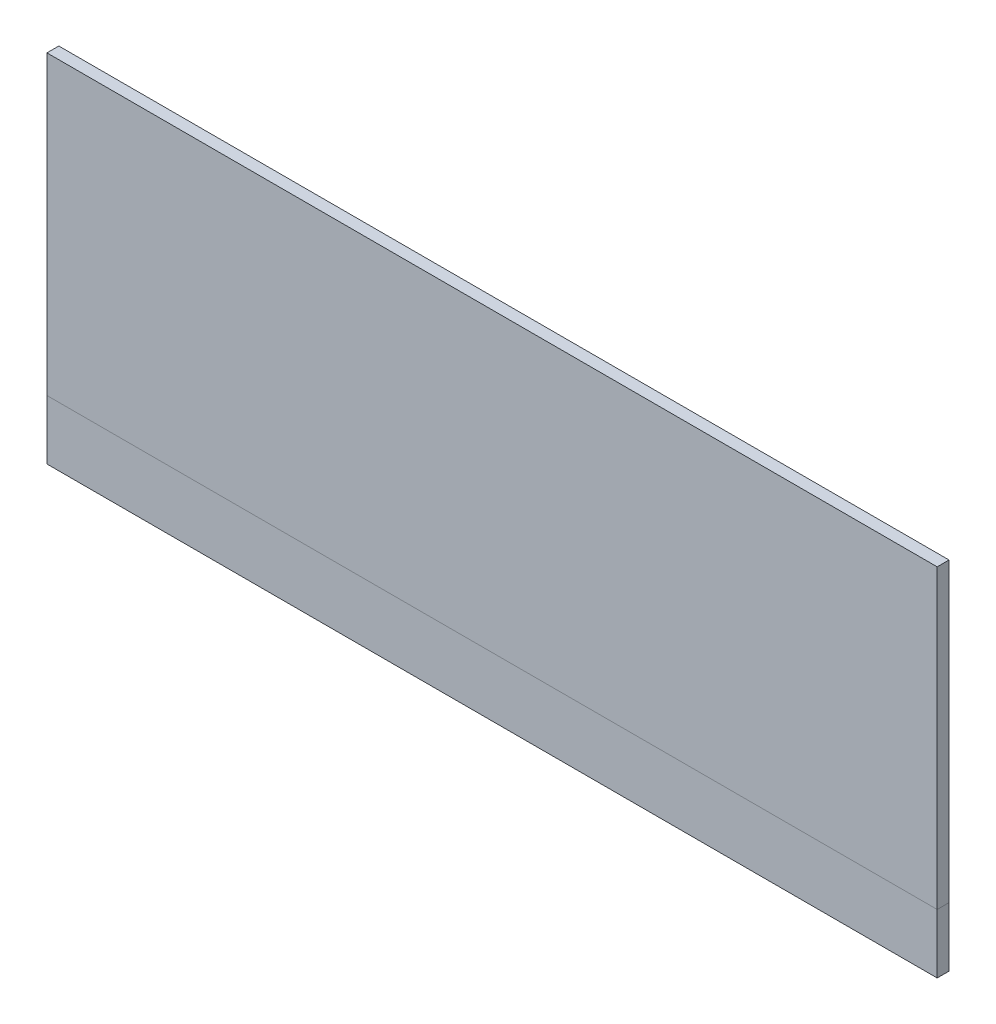
ISO-10303-21;
HEADER;
FILE_DESCRIPTION(('STEP AP214'),'2;1');
FILE_NAME('part.step','',(''),(''),'','','');
FILE_SCHEMA(('AUTOMOTIVE_DESIGN { 1 0 10303 214 1 1 1 1 }'));
ENDSEC;
DATA;
#1=APPLICATION_CONTEXT('core data for automotive mechanical design processes');
#2=APPLICATION_PROTOCOL_DEFINITION('international standard','automotive_design',2000,#1);
#3=PRODUCT_CONTEXT('',#1,'mechanical');
#4=PRODUCT('Part','Part','',(#3));
#5=PRODUCT_RELATED_PRODUCT_CATEGORY('part','',(#4));
#6=PRODUCT_DEFINITION_FORMATION('','',#4);
#7=PRODUCT_DEFINITION_CONTEXT('part definition',#1,'design');
#8=PRODUCT_DEFINITION('design','',#6,#7);
#9=PRODUCT_DEFINITION_SHAPE('','',#8);
#10=(LENGTH_UNIT() NAMED_UNIT(*) SI_UNIT(.MILLI.,.METRE.));
#11=(NAMED_UNIT(*) PLANE_ANGLE_UNIT() SI_UNIT($,.RADIAN.));
#12=(NAMED_UNIT(*) SI_UNIT($,.STERADIAN.) SOLID_ANGLE_UNIT());
#13=UNCERTAINTY_MEASURE_WITH_UNIT(LENGTH_MEASURE(1.E-05),#10,'distance_accuracy_value','');
#14=(GEOMETRIC_REPRESENTATION_CONTEXT(3) GLOBAL_UNCERTAINTY_ASSIGNED_CONTEXT((#13)) GLOBAL_UNIT_ASSIGNED_CONTEXT((#10,
#11,#12)) REPRESENTATION_CONTEXT('',''));
#15=CARTESIAN_POINT('',(0.,0.,0.));
#16=DIRECTION('',(0.,0.,1.));
#17=DIRECTION('',(1.,0.,0.));
#18=AXIS2_PLACEMENT_3D('',#15,#16,#17);
#19=CARTESIAN_POINT('',(-187.5,-62.5,0.));
#20=DIRECTION('',(-1.,0.,0.));
#21=DIRECTION('',(0.,0.,1.));
#22=AXIS2_PLACEMENT_3D('',#19,#20,#21);
#23=PLANE('',#22);
#24=DIRECTION('',(0.,-1.,0.));
#25=VECTOR('',#24,1.);
#26=CARTESIAN_POINT('',(-187.5,-62.5,5.));
#27=LINE('',#26,#25);
#28=CARTESIAN_POINT('',(-187.5,-62.5,5.));
#29=VERTEX_POINT('',#28);
#30=CARTESIAN_POINT('',(-187.5,-87.5,5.));
#31=VERTEX_POINT('',#30);
#32=EDGE_CURVE('E113',#29,#31,#27,.T.);
#33=ORIENTED_EDGE('',*,*,#32,.F.);
#34=DIRECTION('',(0.,0.,1.));
#35=VECTOR('',#34,1.);
#36=CARTESIAN_POINT('',(-187.5,-62.5,0.));
#37=LINE('',#36,#35);
#38=CARTESIAN_POINT('',(-187.5,-62.5,0.));
#39=VERTEX_POINT('',#38);
#40=EDGE_CURVE('E12',#39,#29,#37,.T.);
#41=ORIENTED_EDGE('',*,*,#40,.F.);
#42=DIRECTION('',(0.,-1.,0.));
#43=VECTOR('',#42,1.);
#44=CARTESIAN_POINT('',(-187.5,-62.5,0.));
#45=LINE('',#44,#43);
#46=CARTESIAN_POINT('',(-187.5,-87.5,0.));
#47=VERTEX_POINT('',#46);
#48=EDGE_CURVE('E107',#39,#47,#45,.T.);
#49=ORIENTED_EDGE('',*,*,#48,.T.);
#50=DIRECTION('',(0.,0.,1.));
#51=VECTOR('',#50,1.);
#52=CARTESIAN_POINT('',(-187.5,-87.5,0.));
#53=LINE('',#52,#51);
#54=EDGE_CURVE('E52',#47,#31,#53,.T.);
#55=ORIENTED_EDGE('',*,*,#54,.T.);
#56=EDGE_LOOP('',(#33,#41,#49,#55));
#57=FACE_BOUND('',#56,.T.);
#58=ADVANCED_FACE('F49',(#57),#23,.T.);
#59=CARTESIAN_POINT('',(-187.5,-62.5,0.));
#60=DIRECTION('',(0.,1.,0.));
#61=DIRECTION('',(0.,0.,1.));
#62=AXIS2_PLACEMENT_3D('',#59,#60,#61);
#63=PLANE('',#62);
#64=DIRECTION('',(-1.,0.,0.));
#65=VECTOR('',#64,1.);
#66=CARTESIAN_POINT('',(-187.5,-62.5,5.));
#67=LINE('',#66,#65);
#68=CARTESIAN_POINT('',(187.5,-62.5,5.));
#69=VERTEX_POINT('',#68);
#70=EDGE_CURVE('E109',#69,#29,#67,.T.);
#71=ORIENTED_EDGE('',*,*,#70,.F.);
#72=DIRECTION('',(0.,0.,1.));
#73=VECTOR('',#72,1.);
#74=CARTESIAN_POINT('',(187.5,-62.5,0.));
#75=LINE('',#74,#73);
#76=CARTESIAN_POINT('',(187.5,-62.5,0.));
#77=VERTEX_POINT('',#76);
#78=EDGE_CURVE('E58',#77,#69,#75,.T.);
#79=ORIENTED_EDGE('',*,*,#78,.F.);
#80=DIRECTION('',(-1.,0.,0.));
#81=VECTOR('',#80,1.);
#82=CARTESIAN_POINT('',(-187.5,-62.5,0.));
#83=LINE('',#82,#81);
#84=EDGE_CURVE('E104',#77,#39,#83,.T.);
#85=ORIENTED_EDGE('',*,*,#84,.T.);
#86=ORIENTED_EDGE('',*,*,#40,.T.);
#87=EDGE_LOOP('',(#71,#79,#85,#86));
#88=FACE_BOUND('',#87,.T.);
#89=ADVANCED_FACE('F123',(#88),#63,.T.);
#90=CARTESIAN_POINT('',(187.5,-62.5,0.));
#91=DIRECTION('',(1.,0.,0.));
#92=DIRECTION('',(0.,0.,-1.));
#93=AXIS2_PLACEMENT_3D('',#90,#91,#92);
#94=PLANE('',#93);
#95=DIRECTION('',(0.,1.,0.));
#96=VECTOR('',#95,1.);
#97=CARTESIAN_POINT('',(187.5,-62.5,5.));
#98=LINE('',#97,#96);
#99=CARTESIAN_POINT('',(187.5,-87.5,5.));
#100=VERTEX_POINT('',#99);
#101=EDGE_CURVE('E99',#100,#69,#98,.T.);
#102=ORIENTED_EDGE('',*,*,#101,.F.);
#103=DIRECTION('',(0.,0.,1.));
#104=VECTOR('',#103,1.);
#105=CARTESIAN_POINT('',(187.5,-87.5,0.));
#106=LINE('',#105,#104);
#107=CARTESIAN_POINT('',(187.5,-87.5,0.));
#108=VERTEX_POINT('',#107);
#109=EDGE_CURVE('E94',#108,#100,#106,.T.);
#110=ORIENTED_EDGE('',*,*,#109,.F.);
#111=DIRECTION('',(0.,1.,0.));
#112=VECTOR('',#111,1.);
#113=CARTESIAN_POINT('',(187.5,-62.5,0.));
#114=LINE('',#113,#112);
#115=EDGE_CURVE('E97',#108,#77,#114,.T.);
#116=ORIENTED_EDGE('',*,*,#115,.T.);
#117=ORIENTED_EDGE('',*,*,#78,.T.);
#118=EDGE_LOOP('',(#102,#110,#116,#117));
#119=FACE_BOUND('',#118,.T.);
#120=ADVANCED_FACE('F96',(#119),#94,.T.);
#121=CARTESIAN_POINT('',(-187.5,-87.5,0.));
#122=DIRECTION('',(0.,-1.,0.));
#123=DIRECTION('',(0.,0.,-1.));
#124=AXIS2_PLACEMENT_3D('',#121,#122,#123);
#125=PLANE('',#124);
#126=DIRECTION('',(1.,0.,0.));
#127=VECTOR('',#126,1.);
#128=CARTESIAN_POINT('',(-187.5,-87.5,5.));
#129=LINE('',#128,#127);
#130=EDGE_CURVE('E116',#31,#100,#129,.T.);
#131=ORIENTED_EDGE('',*,*,#130,.F.);
#132=ORIENTED_EDGE('',*,*,#54,.F.);
#133=DIRECTION('',(1.,0.,0.));
#134=VECTOR('',#133,1.);
#135=CARTESIAN_POINT('',(-187.5,-87.5,0.));
#136=LINE('',#135,#134);
#137=EDGE_CURVE('E103',#47,#108,#136,.T.);
#138=ORIENTED_EDGE('',*,*,#137,.T.);
#139=ORIENTED_EDGE('',*,*,#109,.T.);
#140=EDGE_LOOP('',(#131,#132,#138,#139));
#141=FACE_BOUND('',#140,.T.);
#142=ADVANCED_FACE('F106',(#141),#125,.T.);
#143=CARTESIAN_POINT('',(0.,0.,0.));
#144=DIRECTION('',(0.,0.,1.));
#145=DIRECTION('',(1.,0.,0.));
#146=AXIS2_PLACEMENT_3D('',#143,#144,#145);
#147=PLANE('',#146);
#148=ORIENTED_EDGE('',*,*,#48,.F.);
#149=ORIENTED_EDGE('',*,*,#84,.F.);
#150=ORIENTED_EDGE('',*,*,#115,.F.);
#151=ORIENTED_EDGE('',*,*,#137,.F.);
#152=EDGE_LOOP('',(#148,#149,#150,#151));
#153=FACE_BOUND('',#152,.T.);
#154=ADVANCED_FACE('F102',(#153),#147,.F.);
#155=CARTESIAN_POINT('',(0.,0.,5.));
#156=DIRECTION('',(0.,0.,1.));
#157=DIRECTION('',(1.,0.,0.));
#158=AXIS2_PLACEMENT_3D('',#155,#156,#157);
#159=PLANE('',#158);
#160=ORIENTED_EDGE('',*,*,#32,.T.);
#161=ORIENTED_EDGE('',*,*,#130,.T.);
#162=ORIENTED_EDGE('',*,*,#101,.T.);
#163=ORIENTED_EDGE('',*,*,#70,.T.);
#164=EDGE_LOOP('',(#160,#161,#162,#163));
#165=FACE_BOUND('',#164,.T.);
#166=ADVANCED_FACE('F122',(#165),#159,.T.);
#167=CLOSED_SHELL('',(#58,#89,#120,#142,#154,#166));
#168=MANIFOLD_SOLID_BREP('B2',#167);
#169=CARTESIAN_POINT('',(187.5,62.5,5.));
#170=DIRECTION('',(-1.,0.,0.));
#171=DIRECTION('',(0.,-1.,0.));
#172=AXIS2_PLACEMENT_3D('',#169,#170,#171);
#173=PLANE('',#172);
#174=DIRECTION('',(0.,1.,0.));
#175=VECTOR('',#174,1.);
#176=CARTESIAN_POINT('',(187.5,62.5,0.));
#177=LINE('',#176,#175);
#178=CARTESIAN_POINT('',(187.5,-62.5,0.));
#179=VERTEX_POINT('',#178);
#180=CARTESIAN_POINT('',(187.5,62.5,0.));
#181=VERTEX_POINT('',#180);
#182=EDGE_CURVE('E241',#179,#181,#177,.T.);
#183=ORIENTED_EDGE('',*,*,#182,.T.);
#184=DIRECTION('',(0.,0.,-1.));
#185=VECTOR('',#184,1.);
#186=CARTESIAN_POINT('',(187.5,62.5,5.));
#187=LINE('',#186,#185);
#188=CARTESIAN_POINT('',(187.5,62.5,5.));
#189=VERTEX_POINT('',#188);
#190=EDGE_CURVE('E47',#189,#181,#187,.T.);
#191=ORIENTED_EDGE('',*,*,#190,.F.);
#192=DIRECTION('',(0.,1.,0.));
#193=VECTOR('',#192,1.);
#194=CARTESIAN_POINT('',(187.5,62.5,5.));
#195=LINE('',#194,#193);
#196=CARTESIAN_POINT('',(187.5,-62.5,5.));
#197=VERTEX_POINT('',#196);
#198=EDGE_CURVE('E225',#197,#189,#195,.T.);
#199=ORIENTED_EDGE('',*,*,#198,.F.);
#200=DIRECTION('',(0.,0.,-1.));
#201=VECTOR('',#200,1.);
#202=CARTESIAN_POINT('',(187.5,-62.5,5.));
#203=LINE('',#202,#201);
#204=EDGE_CURVE('E237',#197,#179,#203,.T.);
#205=ORIENTED_EDGE('',*,*,#204,.T.);
#206=EDGE_LOOP('',(#183,#191,#199,#205));
#207=FACE_BOUND('',#206,.T.);
#208=ADVANCED_FACE('F173',(#207),#173,.F.);
#209=CARTESIAN_POINT('',(-187.5,62.5,5.));
#210=DIRECTION('',(0.,-1.,0.));
#211=DIRECTION('',(0.,0.,-1.));
#212=AXIS2_PLACEMENT_3D('',#209,#210,#211);
#213=PLANE('',#212);
#214=DIRECTION('',(-1.,0.,0.));
#215=VECTOR('',#214,1.);
#216=CARTESIAN_POINT('',(-187.5,62.5,0.));
#217=LINE('',#216,#215);
#218=CARTESIAN_POINT('',(-187.5,62.5,0.));
#219=VERTEX_POINT('',#218);
#220=EDGE_CURVE('E230',#181,#219,#217,.T.);
#221=ORIENTED_EDGE('',*,*,#220,.T.);
#222=DIRECTION('',(0.,0.,-1.));
#223=VECTOR('',#222,1.);
#224=CARTESIAN_POINT('',(-187.5,62.5,5.));
#225=LINE('',#224,#223);
#226=CARTESIAN_POINT('',(-187.5,62.5,5.));
#227=VERTEX_POINT('',#226);
#228=EDGE_CURVE('E182',#227,#219,#225,.T.);
#229=ORIENTED_EDGE('',*,*,#228,.F.);
#230=DIRECTION('',(-1.,0.,0.));
#231=VECTOR('',#230,1.);
#232=CARTESIAN_POINT('',(-187.5,62.5,5.));
#233=LINE('',#232,#231);
#234=EDGE_CURVE('E220',#189,#227,#233,.T.);
#235=ORIENTED_EDGE('',*,*,#234,.F.);
#236=ORIENTED_EDGE('',*,*,#190,.T.);
#237=EDGE_LOOP('',(#221,#229,#235,#236));
#238=FACE_BOUND('',#237,.T.);
#239=ADVANCED_FACE('F229',(#238),#213,.F.);
#240=CARTESIAN_POINT('',(-187.5,62.5,5.));
#241=DIRECTION('',(1.,0.,0.));
#242=DIRECTION('',(0.,1.,0.));
#243=AXIS2_PLACEMENT_3D('',#240,#241,#242);
#244=PLANE('',#243);
#245=DIRECTION('',(0.,-1.,0.));
#246=VECTOR('',#245,1.);
#247=CARTESIAN_POINT('',(-187.5,62.5,0.));
#248=LINE('',#247,#246);
#249=CARTESIAN_POINT('',(-187.5,-62.5,0.));
#250=VERTEX_POINT('',#249);
#251=EDGE_CURVE('E207',#219,#250,#248,.T.);
#252=ORIENTED_EDGE('',*,*,#251,.T.);
#253=DIRECTION('',(0.,0.,-1.));
#254=VECTOR('',#253,1.);
#255=CARTESIAN_POINT('',(-187.5,-62.5,5.));
#256=LINE('',#255,#254);
#257=CARTESIAN_POINT('',(-187.5,-62.5,5.));
#258=VERTEX_POINT('',#257);
#259=EDGE_CURVE('E232',#258,#250,#256,.T.);
#260=ORIENTED_EDGE('',*,*,#259,.F.);
#261=DIRECTION('',(0.,-1.,0.));
#262=VECTOR('',#261,1.);
#263=CARTESIAN_POINT('',(-187.5,62.5,5.));
#264=LINE('',#263,#262);
#265=EDGE_CURVE('E223',#227,#258,#264,.T.);
#266=ORIENTED_EDGE('',*,*,#265,.F.);
#267=ORIENTED_EDGE('',*,*,#228,.T.);
#268=EDGE_LOOP('',(#252,#260,#266,#267));
#269=FACE_BOUND('',#268,.T.);
#270=ADVANCED_FACE('F233',(#269),#244,.F.);
#271=CARTESIAN_POINT('',(-187.5,-62.5,5.));
#272=DIRECTION('',(0.,1.,0.));
#273=DIRECTION('',(0.,0.,1.));
#274=AXIS2_PLACEMENT_3D('',#271,#272,#273);
#275=PLANE('',#274);
#276=DIRECTION('',(1.,0.,0.));
#277=VECTOR('',#276,1.);
#278=CARTESIAN_POINT('',(-187.5,-62.5,0.));
#279=LINE('',#278,#277);
#280=EDGE_CURVE('E213',#250,#179,#279,.T.);
#281=ORIENTED_EDGE('',*,*,#280,.T.);
#282=ORIENTED_EDGE('',*,*,#204,.F.);
#283=DIRECTION('',(1.,0.,0.));
#284=VECTOR('',#283,1.);
#285=CARTESIAN_POINT('',(-187.5,-62.5,5.));
#286=LINE('',#285,#284);
#287=EDGE_CURVE('E190',#258,#197,#286,.T.);
#288=ORIENTED_EDGE('',*,*,#287,.F.);
#289=ORIENTED_EDGE('',*,*,#259,.T.);
#290=EDGE_LOOP('',(#281,#282,#288,#289));
#291=FACE_BOUND('',#290,.T.);
#292=ADVANCED_FACE('F254',(#291),#275,.F.);
#293=CARTESIAN_POINT('',(0.,0.,5.));
#294=DIRECTION('',(0.,0.,1.));
#295=DIRECTION('',(1.,0.,0.));
#296=AXIS2_PLACEMENT_3D('',#293,#294,#295);
#297=PLANE('',#296);
#298=ORIENTED_EDGE('',*,*,#198,.T.);
#299=ORIENTED_EDGE('',*,*,#234,.T.);
#300=ORIENTED_EDGE('',*,*,#265,.T.);
#301=ORIENTED_EDGE('',*,*,#287,.T.);
#302=EDGE_LOOP('',(#298,#299,#300,#301));
#303=FACE_BOUND('',#302,.T.);
#304=ADVANCED_FACE('F221',(#303),#297,.T.);
#305=CARTESIAN_POINT('',(0.,0.,0.));
#306=DIRECTION('',(0.,0.,1.));
#307=DIRECTION('',(1.,0.,0.));
#308=AXIS2_PLACEMENT_3D('',#305,#306,#307);
#309=PLANE('',#308);
#310=ORIENTED_EDGE('',*,*,#182,.F.);
#311=ORIENTED_EDGE('',*,*,#280,.F.);
#312=ORIENTED_EDGE('',*,*,#251,.F.);
#313=ORIENTED_EDGE('',*,*,#220,.F.);
#314=EDGE_LOOP('',(#310,#311,#312,#313));
#315=FACE_BOUND('',#314,.T.);
#316=ADVANCED_FACE('F257',(#315),#309,.F.);
#317=CLOSED_SHELL('',(#208,#239,#270,#292,#304,#316));
#318=MANIFOLD_SOLID_BREP('B6',#317);
#319=ADVANCED_BREP_SHAPE_REPRESENTATION('',(#18,#168,#318),#14);
#320=SHAPE_DEFINITION_REPRESENTATION(#9,#319);
ENDSEC;
END-ISO-10303-21;
